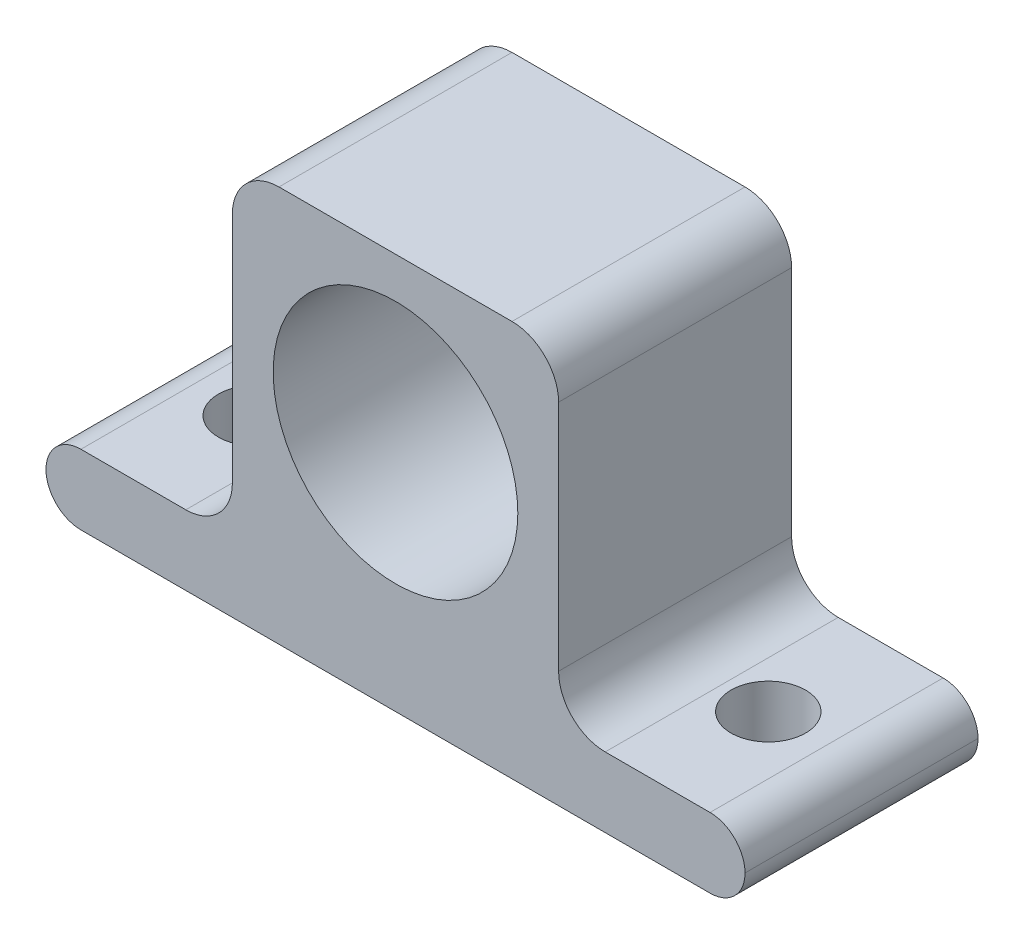
ISO-10303-21;
HEADER;
FILE_DESCRIPTION(('STEP AP214'),'2;1');
FILE_NAME('part.step','',(''),(''),'','','');
FILE_SCHEMA(('AUTOMOTIVE_DESIGN { 1 0 10303 214 1 1 1 1 }'));
ENDSEC;
DATA;
#1=APPLICATION_CONTEXT('core data for automotive mechanical design processes');
#2=APPLICATION_PROTOCOL_DEFINITION('international standard','automotive_design',2000,#1);
#3=PRODUCT_CONTEXT('',#1,'mechanical');
#4=PRODUCT('Part','Part','',(#3));
#5=PRODUCT_RELATED_PRODUCT_CATEGORY('part','',(#4));
#6=PRODUCT_DEFINITION_FORMATION('','',#4);
#7=PRODUCT_DEFINITION_CONTEXT('part definition',#1,'design');
#8=PRODUCT_DEFINITION('design','',#6,#7);
#9=PRODUCT_DEFINITION_SHAPE('','',#8);
#10=(LENGTH_UNIT() NAMED_UNIT(*) SI_UNIT(.MILLI.,.METRE.));
#11=(NAMED_UNIT(*) PLANE_ANGLE_UNIT() SI_UNIT($,.RADIAN.));
#12=(NAMED_UNIT(*) SI_UNIT($,.STERADIAN.) SOLID_ANGLE_UNIT());
#13=UNCERTAINTY_MEASURE_WITH_UNIT(LENGTH_MEASURE(1.E-05),#10,'distance_accuracy_value','');
#14=(GEOMETRIC_REPRESENTATION_CONTEXT(3) GLOBAL_UNCERTAINTY_ASSIGNED_CONTEXT((#13)) GLOBAL_UNIT_ASSIGNED_CONTEXT((#10,
#11,#12)) REPRESENTATION_CONTEXT('',''));
#15=CARTESIAN_POINT('',(0.,0.,0.));
#16=DIRECTION('',(0.,0.,1.));
#17=DIRECTION('',(1.,0.,0.));
#18=AXIS2_PLACEMENT_3D('',#15,#16,#17);
#19=CARTESIAN_POINT('',(15.,3.00000000000001,5.));
#20=DIRECTION('',(0.,-1.,0.));
#21=DIRECTION('',(1.,0.,0.));
#22=AXIS2_PLACEMENT_3D('',#19,#20,#21);
#23=PLANE('',#22);
#24=CARTESIAN_POINT('',(11.,3.00000000000002,0.));
#25=DIRECTION('',(0.,1.,0.));
#26=DIRECTION('',(-1.,0.,0.));
#27=AXIS2_PLACEMENT_3D('',#24,#25,#26);
#28=CIRCLE('',#27,1.6);
#29=CARTESIAN_POINT('',(9.4,3.00000000000002,0.));
#30=VERTEX_POINT('',#29);
#31=EDGE_CURVE('E472',#30,#30,#28,.T.);
#32=ORIENTED_EDGE('',*,*,#31,.F.);
#33=EDGE_LOOP('',(#32));
#34=FACE_BOUND('',#33,.T.);
#35=DIRECTION('',(-1.,0.,0.));
#36=VECTOR('',#35,1.);
#37=CARTESIAN_POINT('',(15.,3.00000000000001,5.));
#38=LINE('',#37,#36);
#39=CARTESIAN_POINT('',(13.5,3.00000000000001,5.));
#40=VERTEX_POINT('',#39);
#41=CARTESIAN_POINT('',(9.,3.00000000000002,5.));
#42=VERTEX_POINT('',#41);
#43=EDGE_CURVE('E182',#40,#42,#38,.T.);
#44=ORIENTED_EDGE('',*,*,#43,.F.);
#45=DIRECTION('',(0.,0.,-1.));
#46=VECTOR('',#45,1.);
#47=CARTESIAN_POINT('',(13.5,3.00000000000001,5.));
#48=LINE('',#47,#46);
#49=CARTESIAN_POINT('',(13.5,3.00000000000001,-5.));
#50=VERTEX_POINT('',#49);
#51=EDGE_CURVE('E11',#40,#50,#48,.T.);
#52=ORIENTED_EDGE('',*,*,#51,.T.);
#53=DIRECTION('',(-1.,0.,0.));
#54=VECTOR('',#53,1.);
#55=CARTESIAN_POINT('',(15.,3.00000000000001,-5.));
#56=LINE('',#55,#54);
#57=CARTESIAN_POINT('',(9.,3.00000000000002,-5.));
#58=VERTEX_POINT('',#57);
#59=EDGE_CURVE('E173',#50,#58,#56,.T.);
#60=ORIENTED_EDGE('',*,*,#59,.T.);
#61=DIRECTION('',(0.,0.,-1.));
#62=VECTOR('',#61,1.);
#63=CARTESIAN_POINT('',(9.,3.00000000000002,5.));
#64=LINE('',#63,#62);
#65=EDGE_CURVE('E201',#58,#42,#64,.F.);
#66=ORIENTED_EDGE('',*,*,#65,.T.);
#67=EDGE_LOOP('',(#44,#52,#60,#66));
#68=FACE_BOUND('',#67,.T.);
#69=ADVANCED_FACE('F38',(#34,#68),#23,.F.);
#70=CARTESIAN_POINT('',(7.,3.00000000000002,5.));
#71=DIRECTION('',(-1.,0.,0.));
#72=DIRECTION('',(0.,-1.,0.));
#73=AXIS2_PLACEMENT_3D('',#70,#71,#72);
#74=PLANE('',#73);
#75=DIRECTION('',(0.,1.,0.));
#76=VECTOR('',#75,1.);
#77=CARTESIAN_POINT('',(7.,3.00000000000002,-5.));
#78=LINE('',#77,#76);
#79=CARTESIAN_POINT('',(7.,5.00000000000002,-5.));
#80=VERTEX_POINT('',#79);
#81=CARTESIAN_POINT('',(7.,15.,-5.));
#82=VERTEX_POINT('',#81);
#83=EDGE_CURVE('E168',#80,#82,#78,.T.);
#84=ORIENTED_EDGE('',*,*,#83,.T.);
#85=DIRECTION('',(0.,0.,-1.));
#86=VECTOR('',#85,1.);
#87=CARTESIAN_POINT('',(7.,15.,5.));
#88=LINE('',#87,#86);
#89=CARTESIAN_POINT('',(7.,15.,5.));
#90=VERTEX_POINT('',#89);
#91=EDGE_CURVE('E146',#82,#90,#88,.F.);
#92=ORIENTED_EDGE('',*,*,#91,.T.);
#93=DIRECTION('',(0.,1.,0.));
#94=VECTOR('',#93,1.);
#95=CARTESIAN_POINT('',(7.,3.00000000000002,5.));
#96=LINE('',#95,#94);
#97=CARTESIAN_POINT('',(7.,5.00000000000002,5.));
#98=VERTEX_POINT('',#97);
#99=EDGE_CURVE('E287',#98,#90,#96,.T.);
#100=ORIENTED_EDGE('',*,*,#99,.F.);
#101=DIRECTION('',(0.,0.,-1.));
#102=VECTOR('',#101,1.);
#103=CARTESIAN_POINT('',(7.,5.00000000000002,-5.));
#104=LINE('',#103,#102);
#105=EDGE_CURVE('E151',#98,#80,#104,.T.);
#106=ORIENTED_EDGE('',*,*,#105,.T.);
#107=EDGE_LOOP('',(#84,#92,#100,#106));
#108=FACE_BOUND('',#107,.T.);
#109=ADVANCED_FACE('F310',(#108),#74,.F.);
#110=CARTESIAN_POINT('',(7.,17.,5.));
#111=DIRECTION('',(0.,-1.,0.));
#112=DIRECTION('',(1.,0.,0.));
#113=AXIS2_PLACEMENT_3D('',#110,#111,#112);
#114=PLANE('',#113);
#115=DIRECTION('',(-1.,0.,0.));
#116=VECTOR('',#115,1.);
#117=CARTESIAN_POINT('',(7.,17.,5.));
#118=LINE('',#117,#116);
#119=CARTESIAN_POINT('',(5.,17.,5.));
#120=VERTEX_POINT('',#119);
#121=CARTESIAN_POINT('',(-5.,17.,5.));
#122=VERTEX_POINT('',#121);
#123=EDGE_CURVE('E161',#120,#122,#118,.T.);
#124=ORIENTED_EDGE('',*,*,#123,.F.);
#125=DIRECTION('',(0.,0.,-1.));
#126=VECTOR('',#125,1.);
#127=CARTESIAN_POINT('',(5.,17.,5.));
#128=LINE('',#127,#126);
#129=CARTESIAN_POINT('',(5.,17.,-5.));
#130=VERTEX_POINT('',#129);
#131=EDGE_CURVE('E145',#120,#130,#128,.T.);
#132=ORIENTED_EDGE('',*,*,#131,.T.);
#133=DIRECTION('',(-1.,0.,0.));
#134=VECTOR('',#133,1.);
#135=CARTESIAN_POINT('',(7.,17.,-5.));
#136=LINE('',#135,#134);
#137=CARTESIAN_POINT('',(-5.,17.,-5.));
#138=VERTEX_POINT('',#137);
#139=EDGE_CURVE('E158',#130,#138,#136,.T.);
#140=ORIENTED_EDGE('',*,*,#139,.T.);
#141=DIRECTION('',(0.,0.,-1.));
#142=VECTOR('',#141,1.);
#143=CARTESIAN_POINT('',(-5.,17.,5.));
#144=LINE('',#143,#142);
#145=EDGE_CURVE('E162',#138,#122,#144,.F.);
#146=ORIENTED_EDGE('',*,*,#145,.T.);
#147=EDGE_LOOP('',(#124,#132,#140,#146));
#148=FACE_BOUND('',#147,.T.);
#149=ADVANCED_FACE('F157',(#148),#114,.F.);
#150=CARTESIAN_POINT('',(-7.,17.,5.));
#151=DIRECTION('',(1.,0.,0.));
#152=DIRECTION('',(0.,1.,0.));
#153=AXIS2_PLACEMENT_3D('',#150,#151,#152);
#154=PLANE('',#153);
#155=DIRECTION('',(0.,-1.,0.));
#156=VECTOR('',#155,1.);
#157=CARTESIAN_POINT('',(-7.,17.,5.));
#158=LINE('',#157,#156);
#159=CARTESIAN_POINT('',(-7.,15.,5.));
#160=VERTEX_POINT('',#159);
#161=CARTESIAN_POINT('',(-7.,5.00000000000002,5.));
#162=VERTEX_POINT('',#161);
#163=EDGE_CURVE('E269',#160,#162,#158,.T.);
#164=ORIENTED_EDGE('',*,*,#163,.F.);
#165=DIRECTION('',(0.,0.,-1.));
#166=VECTOR('',#165,1.);
#167=CARTESIAN_POINT('',(-7.,15.,5.));
#168=LINE('',#167,#166);
#169=CARTESIAN_POINT('',(-7.,15.,-5.));
#170=VERTEX_POINT('',#169);
#171=EDGE_CURVE('E195',#160,#170,#168,.T.);
#172=ORIENTED_EDGE('',*,*,#171,.T.);
#173=DIRECTION('',(0.,-1.,0.));
#174=VECTOR('',#173,1.);
#175=CARTESIAN_POINT('',(-7.,17.,-5.));
#176=LINE('',#175,#174);
#177=CARTESIAN_POINT('',(-7.,5.00000000000002,-5.));
#178=VERTEX_POINT('',#177);
#179=EDGE_CURVE('E167',#170,#178,#176,.T.);
#180=ORIENTED_EDGE('',*,*,#179,.T.);
#181=DIRECTION('',(0.,0.,-1.));
#182=VECTOR('',#181,1.);
#183=CARTESIAN_POINT('',(-7.,5.00000000000002,5.));
#184=LINE('',#183,#182);
#185=EDGE_CURVE('E193',#178,#162,#184,.F.);
#186=ORIENTED_EDGE('',*,*,#185,.T.);
#187=EDGE_LOOP('',(#164,#172,#180,#186));
#188=FACE_BOUND('',#187,.T.);
#189=ADVANCED_FACE('F295',(#188),#154,.F.);
#190=CARTESIAN_POINT('',(-7.,3.00000000000002,5.));
#191=DIRECTION('',(0.,-1.,0.));
#192=DIRECTION('',(1.,0.,0.));
#193=AXIS2_PLACEMENT_3D('',#190,#191,#192);
#194=PLANE('',#193);
#195=CARTESIAN_POINT('',(-11.,3.00000000000003,0.));
#196=DIRECTION('',(0.,1.,0.));
#197=DIRECTION('',(-1.,0.,0.));
#198=AXIS2_PLACEMENT_3D('',#195,#196,#197);
#199=CIRCLE('',#198,1.6);
#200=CARTESIAN_POINT('',(-12.6,3.00000000000003,0.));
#201=VERTEX_POINT('',#200);
#202=EDGE_CURVE('E234',#201,#201,#199,.T.);
#203=ORIENTED_EDGE('',*,*,#202,.F.);
#204=EDGE_LOOP('',(#203));
#205=FACE_BOUND('',#204,.T.);
#206=DIRECTION('',(-1.,0.,0.));
#207=VECTOR('',#206,1.);
#208=CARTESIAN_POINT('',(-7.,3.00000000000002,-5.));
#209=LINE('',#208,#207);
#210=CARTESIAN_POINT('',(-9.,3.00000000000002,-5.));
#211=VERTEX_POINT('',#210);
#212=CARTESIAN_POINT('',(-13.5,3.00000000000001,-5.));
#213=VERTEX_POINT('',#212);
#214=EDGE_CURVE('E171',#211,#213,#209,.T.);
#215=ORIENTED_EDGE('',*,*,#214,.T.);
#216=DIRECTION('',(0.,0.,-1.));
#217=VECTOR('',#216,1.);
#218=CARTESIAN_POINT('',(-13.5,3.00000000000001,5.));
#219=LINE('',#218,#217);
#220=CARTESIAN_POINT('',(-13.5,3.00000000000001,5.));
#221=VERTEX_POINT('',#220);
#222=EDGE_CURVE('E47',#213,#221,#219,.F.);
#223=ORIENTED_EDGE('',*,*,#222,.T.);
#224=DIRECTION('',(-1.,0.,0.));
#225=VECTOR('',#224,1.);
#226=CARTESIAN_POINT('',(-7.,3.00000000000002,5.));
#227=LINE('',#226,#225);
#228=CARTESIAN_POINT('',(-9.,3.00000000000002,5.));
#229=VERTEX_POINT('',#228);
#230=EDGE_CURVE('E264',#229,#221,#227,.T.);
#231=ORIENTED_EDGE('',*,*,#230,.F.);
#232=DIRECTION('',(0.,0.,-1.));
#233=VECTOR('',#232,1.);
#234=CARTESIAN_POINT('',(-9.,3.00000000000002,-5.));
#235=LINE('',#234,#233);
#236=EDGE_CURVE('E198',#229,#211,#235,.T.);
#237=ORIENTED_EDGE('',*,*,#236,.T.);
#238=EDGE_LOOP('',(#215,#223,#231,#237));
#239=FACE_BOUND('',#238,.T.);
#240=ADVANCED_FACE('F263',(#205,#239),#194,.F.);
#241=CARTESIAN_POINT('',(-15.,0.,5.));
#242=DIRECTION('',(0.,1.,0.));
#243=DIRECTION('',(-1.,0.,0.));
#244=AXIS2_PLACEMENT_3D('',#241,#242,#243);
#245=PLANE('',#244);
#246=CARTESIAN_POINT('',(11.,0.,0.));
#247=DIRECTION('',(0.,1.,0.));
#248=DIRECTION('',(-1.,0.,0.));
#249=AXIS2_PLACEMENT_3D('',#246,#247,#248);
#250=CIRCLE('',#249,1.6);
#251=CARTESIAN_POINT('',(9.4,0.,0.));
#252=VERTEX_POINT('',#251);
#253=EDGE_CURVE('E282',#252,#252,#250,.T.);
#254=ORIENTED_EDGE('',*,*,#253,.T.);
#255=EDGE_LOOP('',(#254));
#256=FACE_BOUND('',#255,.T.);
#257=CARTESIAN_POINT('',(-11.,0.,0.));
#258=DIRECTION('',(0.,1.,0.));
#259=DIRECTION('',(-1.,0.,0.));
#260=AXIS2_PLACEMENT_3D('',#257,#258,#259);
#261=CIRCLE('',#260,1.6);
#262=CARTESIAN_POINT('',(-12.6,0.,0.));
#263=VERTEX_POINT('',#262);
#264=EDGE_CURVE('E239',#263,#263,#261,.T.);
#265=ORIENTED_EDGE('',*,*,#264,.T.);
#266=EDGE_LOOP('',(#265));
#267=FACE_BOUND('',#266,.T.);
#268=DIRECTION('',(1.,0.,0.));
#269=VECTOR('',#268,1.);
#270=CARTESIAN_POINT('',(-15.,0.,5.));
#271=LINE('',#270,#269);
#272=CARTESIAN_POINT('',(-13.5,0.,5.));
#273=VERTEX_POINT('',#272);
#274=CARTESIAN_POINT('',(13.5,0.,5.));
#275=VERTEX_POINT('',#274);
#276=EDGE_CURVE('E183',#273,#275,#271,.T.);
#277=ORIENTED_EDGE('',*,*,#276,.F.);
#278=DIRECTION('',(0.,0.,-1.));
#279=VECTOR('',#278,1.);
#280=CARTESIAN_POINT('',(-13.5,0.,5.));
#281=LINE('',#280,#279);
#282=CARTESIAN_POINT('',(-13.5,0.,-5.));
#283=VERTEX_POINT('',#282);
#284=EDGE_CURVE('E215',#273,#283,#281,.T.);
#285=ORIENTED_EDGE('',*,*,#284,.T.);
#286=DIRECTION('',(1.,0.,0.));
#287=VECTOR('',#286,1.);
#288=CARTESIAN_POINT('',(-15.,0.,-5.));
#289=LINE('',#288,#287);
#290=CARTESIAN_POINT('',(13.5,0.,-5.));
#291=VERTEX_POINT('',#290);
#292=EDGE_CURVE('E179',#283,#291,#289,.T.);
#293=ORIENTED_EDGE('',*,*,#292,.T.);
#294=DIRECTION('',(0.,0.,-1.));
#295=VECTOR('',#294,1.);
#296=CARTESIAN_POINT('',(13.5,0.,5.));
#297=LINE('',#296,#295);
#298=EDGE_CURVE('E213',#291,#275,#297,.F.);
#299=ORIENTED_EDGE('',*,*,#298,.T.);
#300=EDGE_LOOP('',(#277,#285,#293,#299));
#301=FACE_BOUND('',#300,.T.);
#302=ADVANCED_FACE('F251',(#256,#267,#301),#245,.F.);
#303=CARTESIAN_POINT('',(0.,0.,5.));
#304=DIRECTION('',(0.,0.,-1.));
#305=DIRECTION('',(-1.,0.,0.));
#306=AXIS2_PLACEMENT_3D('',#303,#304,#305);
#307=PLANE('',#306);
#308=CARTESIAN_POINT('',(0.,10.,5.));
#309=DIRECTION('',(0.,0.,1.));
#310=DIRECTION('',(1.,0.,0.));
#311=AXIS2_PLACEMENT_3D('',#308,#309,#310);
#312=CIRCLE('',#311,5.25);
#313=CARTESIAN_POINT('',(5.25,10.,5.));
#314=VERTEX_POINT('',#313);
#315=EDGE_CURVE('E277',#314,#314,#312,.T.);
#316=ORIENTED_EDGE('',*,*,#315,.F.);
#317=EDGE_LOOP('',(#316));
#318=FACE_BOUND('',#317,.T.);
#319=CARTESIAN_POINT('',(-13.5,1.50000000000001,5.));
#320=DIRECTION('',(0.,0.,-1.));
#321=DIRECTION('',(-1.,0.,0.));
#322=AXIS2_PLACEMENT_3D('',#319,#320,#321);
#323=CIRCLE('',#322,1.5);
#324=CARTESIAN_POINT('',(-15.,1.50000000000001,5.));
#325=VERTEX_POINT('',#324);
#326=EDGE_CURVE('E228',#221,#325,#323,.F.);
#327=ORIENTED_EDGE('',*,*,#326,.T.);
#328=CARTESIAN_POINT('',(-13.5,1.50000000000001,5.));
#329=DIRECTION('',(0.,0.,-1.));
#330=DIRECTION('',(-1.,0.,0.));
#331=AXIS2_PLACEMENT_3D('',#328,#329,#330);
#332=CIRCLE('',#331,1.5);
#333=EDGE_CURVE('E230',#325,#273,#332,.F.);
#334=ORIENTED_EDGE('',*,*,#333,.T.);
#335=ORIENTED_EDGE('',*,*,#276,.T.);
#336=CARTESIAN_POINT('',(13.5,1.5,5.));
#337=DIRECTION('',(0.,0.,-1.));
#338=DIRECTION('',(-1.,0.,0.));
#339=AXIS2_PLACEMENT_3D('',#336,#337,#338);
#340=CIRCLE('',#339,1.5);
#341=CARTESIAN_POINT('',(15.,1.5,5.));
#342=VERTEX_POINT('',#341);
#343=EDGE_CURVE('E60',#275,#342,#340,.F.);
#344=ORIENTED_EDGE('',*,*,#343,.T.);
#345=CARTESIAN_POINT('',(13.5,1.50000000000001,5.));
#346=DIRECTION('',(0.,0.,-1.));
#347=DIRECTION('',(-1.,0.,0.));
#348=AXIS2_PLACEMENT_3D('',#345,#346,#347);
#349=CIRCLE('',#348,1.5);
#350=EDGE_CURVE('E55',#342,#40,#349,.F.);
#351=ORIENTED_EDGE('',*,*,#350,.T.);
#352=ORIENTED_EDGE('',*,*,#43,.T.);
#353=CARTESIAN_POINT('',(9.,5.00000000000002,5.));
#354=DIRECTION('',(0.,0.,-1.));
#355=DIRECTION('',(-1.,0.,0.));
#356=AXIS2_PLACEMENT_3D('',#353,#354,#355);
#357=CIRCLE('',#356,2.);
#358=EDGE_CURVE('E211',#42,#98,#357,.T.);
#359=ORIENTED_EDGE('',*,*,#358,.T.);
#360=ORIENTED_EDGE('',*,*,#99,.T.);
#361=CARTESIAN_POINT('',(5.,15.,5.));
#362=DIRECTION('',(0.,0.,-1.));
#363=DIRECTION('',(-1.,0.,0.));
#364=AXIS2_PLACEMENT_3D('',#361,#362,#363);
#365=CIRCLE('',#364,2.);
#366=EDGE_CURVE('E191',#90,#120,#365,.F.);
#367=ORIENTED_EDGE('',*,*,#366,.T.);
#368=ORIENTED_EDGE('',*,*,#123,.T.);
#369=CARTESIAN_POINT('',(-5.,15.,5.));
#370=DIRECTION('',(0.,0.,-1.));
#371=DIRECTION('',(-1.,0.,0.));
#372=AXIS2_PLACEMENT_3D('',#369,#370,#371);
#373=CIRCLE('',#372,2.);
#374=EDGE_CURVE('E189',#122,#160,#373,.F.);
#375=ORIENTED_EDGE('',*,*,#374,.T.);
#376=ORIENTED_EDGE('',*,*,#163,.T.);
#377=CARTESIAN_POINT('',(-9.,5.00000000000002,5.));
#378=DIRECTION('',(0.,0.,-1.));
#379=DIRECTION('',(-1.,0.,0.));
#380=AXIS2_PLACEMENT_3D('',#377,#378,#379);
#381=CIRCLE('',#380,2.);
#382=EDGE_CURVE('E206',#162,#229,#381,.T.);
#383=ORIENTED_EDGE('',*,*,#382,.T.);
#384=ORIENTED_EDGE('',*,*,#230,.T.);
#385=EDGE_LOOP('',(#327,#334,#335,#344,#351,#352,#359,#360,#367,#368,#375,#376,#383,#384));
#386=FACE_BOUND('',#385,.T.);
#387=ADVANCED_FACE('F266',(#318,#386),#307,.F.);
#388=CARTESIAN_POINT('',(0.,0.,-5.));
#389=DIRECTION('',(0.,0.,-1.));
#390=DIRECTION('',(-1.,0.,0.));
#391=AXIS2_PLACEMENT_3D('',#388,#389,#390);
#392=PLANE('',#391);
#393=CARTESIAN_POINT('',(0.,10.,-5.));
#394=DIRECTION('',(0.,0.,1.));
#395=DIRECTION('',(1.,0.,0.));
#396=AXIS2_PLACEMENT_3D('',#393,#394,#395);
#397=CIRCLE('',#396,5.25);
#398=CARTESIAN_POINT('',(5.25,10.,-5.));
#399=VERTEX_POINT('',#398);
#400=EDGE_CURVE('E274',#399,#399,#397,.T.);
#401=ORIENTED_EDGE('',*,*,#400,.T.);
#402=EDGE_LOOP('',(#401));
#403=FACE_BOUND('',#402,.T.);
#404=ORIENTED_EDGE('',*,*,#292,.F.);
#405=CARTESIAN_POINT('',(-13.5,1.50000000000001,-5.));
#406=DIRECTION('',(0.,0.,-1.));
#407=DIRECTION('',(-1.,0.,0.));
#408=AXIS2_PLACEMENT_3D('',#405,#406,#407);
#409=CIRCLE('',#408,1.5);
#410=CARTESIAN_POINT('',(-15.,1.50000000000001,-5.));
#411=VERTEX_POINT('',#410);
#412=EDGE_CURVE('E224',#283,#411,#409,.T.);
#413=ORIENTED_EDGE('',*,*,#412,.T.);
#414=CARTESIAN_POINT('',(-13.5,1.50000000000001,-5.));
#415=DIRECTION('',(0.,0.,-1.));
#416=DIRECTION('',(-1.,0.,0.));
#417=AXIS2_PLACEMENT_3D('',#414,#415,#416);
#418=CIRCLE('',#417,1.5);
#419=EDGE_CURVE('E222',#411,#213,#418,.T.);
#420=ORIENTED_EDGE('',*,*,#419,.T.);
#421=ORIENTED_EDGE('',*,*,#214,.F.);
#422=CARTESIAN_POINT('',(-9.,5.00000000000002,-5.));
#423=DIRECTION('',(0.,0.,-1.));
#424=DIRECTION('',(-1.,0.,0.));
#425=AXIS2_PLACEMENT_3D('',#422,#423,#424);
#426=CIRCLE('',#425,2.);
#427=EDGE_CURVE('E204',#211,#178,#426,.F.);
#428=ORIENTED_EDGE('',*,*,#427,.T.);
#429=ORIENTED_EDGE('',*,*,#179,.F.);
#430=CARTESIAN_POINT('',(-5.,15.,-5.));
#431=DIRECTION('',(0.,0.,-1.));
#432=DIRECTION('',(-1.,0.,0.));
#433=AXIS2_PLACEMENT_3D('',#430,#431,#432);
#434=CIRCLE('',#433,2.);
#435=EDGE_CURVE('E152',#170,#138,#434,.T.);
#436=ORIENTED_EDGE('',*,*,#435,.T.);
#437=ORIENTED_EDGE('',*,*,#139,.F.);
#438=CARTESIAN_POINT('',(5.,15.,-5.));
#439=DIRECTION('',(0.,0.,-1.));
#440=DIRECTION('',(-1.,0.,0.));
#441=AXIS2_PLACEMENT_3D('',#438,#439,#440);
#442=CIRCLE('',#441,2.);
#443=EDGE_CURVE('E141',#130,#82,#442,.T.);
#444=ORIENTED_EDGE('',*,*,#443,.T.);
#445=ORIENTED_EDGE('',*,*,#83,.F.);
#446=CARTESIAN_POINT('',(9.,5.00000000000002,-5.));
#447=DIRECTION('',(0.,0.,-1.));
#448=DIRECTION('',(-1.,0.,0.));
#449=AXIS2_PLACEMENT_3D('',#446,#447,#448);
#450=CIRCLE('',#449,2.);
#451=EDGE_CURVE('E208',#80,#58,#450,.F.);
#452=ORIENTED_EDGE('',*,*,#451,.T.);
#453=ORIENTED_EDGE('',*,*,#59,.F.);
#454=CARTESIAN_POINT('',(13.5,1.50000000000001,-5.));
#455=DIRECTION('',(0.,0.,-1.));
#456=DIRECTION('',(-1.,0.,0.));
#457=AXIS2_PLACEMENT_3D('',#454,#455,#456);
#458=CIRCLE('',#457,1.5);
#459=CARTESIAN_POINT('',(15.,1.5,-5.));
#460=VERTEX_POINT('',#459);
#461=EDGE_CURVE('E220',#50,#460,#458,.T.);
#462=ORIENTED_EDGE('',*,*,#461,.T.);
#463=CARTESIAN_POINT('',(13.5,1.5,-5.));
#464=DIRECTION('',(0.,0.,-1.));
#465=DIRECTION('',(-1.,0.,0.));
#466=AXIS2_PLACEMENT_3D('',#463,#464,#465);
#467=CIRCLE('',#466,1.5);
#468=EDGE_CURVE('E218',#460,#291,#467,.T.);
#469=ORIENTED_EDGE('',*,*,#468,.T.);
#470=EDGE_LOOP('',(#404,#413,#420,#421,#428,#429,#436,#437,#444,#445,#452,#453,#462,#469));
#471=FACE_BOUND('',#470,.T.);
#472=ADVANCED_FACE('F165',(#403,#471),#392,.T.);
#473=CARTESIAN_POINT('',(0.,10.,-5.));
#474=DIRECTION('',(0.,0.,1.));
#475=DIRECTION('',(1.,0.,0.));
#476=AXIS2_PLACEMENT_3D('',#473,#474,#475);
#477=CYLINDRICAL_SURFACE('',#476,5.25);
#478=ORIENTED_EDGE('',*,*,#400,.F.);
#479=EDGE_LOOP('',(#478));
#480=FACE_BOUND('',#479,.T.);
#481=ORIENTED_EDGE('',*,*,#315,.T.);
#482=EDGE_LOOP('',(#481));
#483=FACE_BOUND('',#482,.T.);
#484=ADVANCED_FACE('F332',(#480,#483),#477,.F.);
#485=CARTESIAN_POINT('',(-11.,0.,0.));
#486=DIRECTION('',(0.,1.,0.));
#487=DIRECTION('',(-1.,0.,0.));
#488=AXIS2_PLACEMENT_3D('',#485,#486,#487);
#489=CYLINDRICAL_SURFACE('',#488,1.6);
#490=ORIENTED_EDGE('',*,*,#264,.F.);
#491=EDGE_LOOP('',(#490));
#492=FACE_BOUND('',#491,.T.);
#493=ORIENTED_EDGE('',*,*,#202,.T.);
#494=EDGE_LOOP('',(#493));
#495=FACE_BOUND('',#494,.T.);
#496=ADVANCED_FACE('F326',(#492,#495),#489,.F.);
#497=CARTESIAN_POINT('',(11.,0.,0.));
#498=DIRECTION('',(0.,1.,0.));
#499=DIRECTION('',(-1.,0.,0.));
#500=AXIS2_PLACEMENT_3D('',#497,#498,#499);
#501=CYLINDRICAL_SURFACE('',#500,1.6);
#502=ORIENTED_EDGE('',*,*,#253,.F.);
#503=EDGE_LOOP('',(#502));
#504=FACE_BOUND('',#503,.T.);
#505=ORIENTED_EDGE('',*,*,#31,.T.);
#506=EDGE_LOOP('',(#505));
#507=FACE_BOUND('',#506,.T.);
#508=ADVANCED_FACE('F322',(#504,#507),#501,.F.);
#509=CARTESIAN_POINT('',(5.,15.,5.));
#510=DIRECTION('',(0.,0.,-1.));
#511=DIRECTION('',(-1.,0.,0.));
#512=AXIS2_PLACEMENT_3D('',#509,#510,#511);
#513=CYLINDRICAL_SURFACE('',#512,2.);
#514=ORIENTED_EDGE('',*,*,#366,.F.);
#515=ORIENTED_EDGE('',*,*,#91,.F.);
#516=ORIENTED_EDGE('',*,*,#443,.F.);
#517=ORIENTED_EDGE('',*,*,#131,.F.);
#518=EDGE_LOOP('',(#514,#515,#516,#517));
#519=FACE_BOUND('',#518,.T.);
#520=ADVANCED_FACE('F144',(#519),#513,.T.);
#521=CARTESIAN_POINT('',(-5.,15.,5.));
#522=DIRECTION('',(0.,0.,-1.));
#523=DIRECTION('',(-1.,0.,0.));
#524=AXIS2_PLACEMENT_3D('',#521,#522,#523);
#525=CYLINDRICAL_SURFACE('',#524,2.);
#526=ORIENTED_EDGE('',*,*,#374,.F.);
#527=ORIENTED_EDGE('',*,*,#145,.F.);
#528=ORIENTED_EDGE('',*,*,#435,.F.);
#529=ORIENTED_EDGE('',*,*,#171,.F.);
#530=EDGE_LOOP('',(#526,#527,#528,#529));
#531=FACE_BOUND('',#530,.T.);
#532=ADVANCED_FACE('F293',(#531),#525,.T.);
#533=CARTESIAN_POINT('',(-9.,5.00000000000002,5.));
#534=DIRECTION('',(0.,0.,1.));
#535=DIRECTION('',(1.,0.,0.));
#536=AXIS2_PLACEMENT_3D('',#533,#534,#535);
#537=CYLINDRICAL_SURFACE('',#536,2.);
#538=ORIENTED_EDGE('',*,*,#382,.F.);
#539=ORIENTED_EDGE('',*,*,#185,.F.);
#540=ORIENTED_EDGE('',*,*,#427,.F.);
#541=ORIENTED_EDGE('',*,*,#236,.F.);
#542=EDGE_LOOP('',(#538,#539,#540,#541));
#543=FACE_BOUND('',#542,.T.);
#544=ADVANCED_FACE('F298',(#543),#537,.F.);
#545=CARTESIAN_POINT('',(9.,5.00000000000002,5.));
#546=DIRECTION('',(0.,0.,1.));
#547=DIRECTION('',(1.,0.,0.));
#548=AXIS2_PLACEMENT_3D('',#545,#546,#547);
#549=CYLINDRICAL_SURFACE('',#548,2.);
#550=ORIENTED_EDGE('',*,*,#358,.F.);
#551=ORIENTED_EDGE('',*,*,#65,.F.);
#552=ORIENTED_EDGE('',*,*,#451,.F.);
#553=ORIENTED_EDGE('',*,*,#105,.F.);
#554=EDGE_LOOP('',(#550,#551,#552,#553));
#555=FACE_BOUND('',#554,.T.);
#556=ADVANCED_FACE('F300',(#555),#549,.F.);
#557=CARTESIAN_POINT('',(-13.5,1.50000000000001,5.));
#558=DIRECTION('',(0.,0.,-1.));
#559=DIRECTION('',(-1.,0.,0.));
#560=AXIS2_PLACEMENT_3D('',#557,#558,#559);
#561=CYLINDRICAL_SURFACE('',#560,1.5);
#562=DIRECTION('',(0.,0.,-1.));
#563=VECTOR('',#562,1.);
#564=CARTESIAN_POINT('',(-15.,1.50000000000001,5.));
#565=LINE('',#564,#563);
#566=EDGE_CURVE('E232',#325,#411,#565,.T.);
#567=ORIENTED_EDGE('',*,*,#566,.F.);
#568=ORIENTED_EDGE('',*,*,#326,.F.);
#569=ORIENTED_EDGE('',*,*,#222,.F.);
#570=ORIENTED_EDGE('',*,*,#419,.F.);
#571=EDGE_LOOP('',(#567,#568,#569,#570));
#572=FACE_BOUND('',#571,.T.);
#573=ADVANCED_FACE('F258',(#572),#561,.T.);
#574=CARTESIAN_POINT('',(-13.5,1.50000000000001,5.));
#575=DIRECTION('',(0.,0.,-1.));
#576=DIRECTION('',(-1.,0.,0.));
#577=AXIS2_PLACEMENT_3D('',#574,#575,#576);
#578=CYLINDRICAL_SURFACE('',#577,1.5);
#579=ORIENTED_EDGE('',*,*,#333,.F.);
#580=ORIENTED_EDGE('',*,*,#566,.T.);
#581=ORIENTED_EDGE('',*,*,#412,.F.);
#582=ORIENTED_EDGE('',*,*,#284,.F.);
#583=EDGE_LOOP('',(#579,#580,#581,#582));
#584=FACE_BOUND('',#583,.T.);
#585=ADVANCED_FACE('F253',(#584),#578,.T.);
#586=CARTESIAN_POINT('',(13.5,1.5,5.));
#587=DIRECTION('',(0.,0.,-1.));
#588=DIRECTION('',(-1.,0.,0.));
#589=AXIS2_PLACEMENT_3D('',#586,#587,#588);
#590=CYLINDRICAL_SURFACE('',#589,1.5);
#591=DIRECTION('',(0.,0.,-1.));
#592=VECTOR('',#591,1.);
#593=CARTESIAN_POINT('',(15.,1.5,5.));
#594=LINE('',#593,#592);
#595=EDGE_CURVE('E42',#342,#460,#594,.T.);
#596=ORIENTED_EDGE('',*,*,#595,.F.);
#597=ORIENTED_EDGE('',*,*,#343,.F.);
#598=ORIENTED_EDGE('',*,*,#298,.F.);
#599=ORIENTED_EDGE('',*,*,#468,.F.);
#600=EDGE_LOOP('',(#596,#597,#598,#599));
#601=FACE_BOUND('',#600,.T.);
#602=ADVANCED_FACE('F40',(#601),#590,.T.);
#603=CARTESIAN_POINT('',(13.5,1.50000000000001,5.));
#604=DIRECTION('',(0.,0.,-1.));
#605=DIRECTION('',(-1.,0.,0.));
#606=AXIS2_PLACEMENT_3D('',#603,#604,#605);
#607=CYLINDRICAL_SURFACE('',#606,1.5);
#608=ORIENTED_EDGE('',*,*,#350,.F.);
#609=ORIENTED_EDGE('',*,*,#595,.T.);
#610=ORIENTED_EDGE('',*,*,#461,.F.);
#611=ORIENTED_EDGE('',*,*,#51,.F.);
#612=EDGE_LOOP('',(#608,#609,#610,#611));
#613=FACE_BOUND('',#612,.T.);
#614=ADVANCED_FACE('F243',(#613),#607,.T.);
#615=CLOSED_SHELL('',(#69,#109,#149,#189,#240,#302,#387,#472,#484,#496,#508,#520,#532,#544,#556,
#573,#585,#602,#614));
#616=MANIFOLD_SOLID_BREP('B2',#615);
#617=ADVANCED_BREP_SHAPE_REPRESENTATION('',(#18,#616),#14);
#618=SHAPE_DEFINITION_REPRESENTATION(#9,#617);
ENDSEC;
END-ISO-10303-21;
